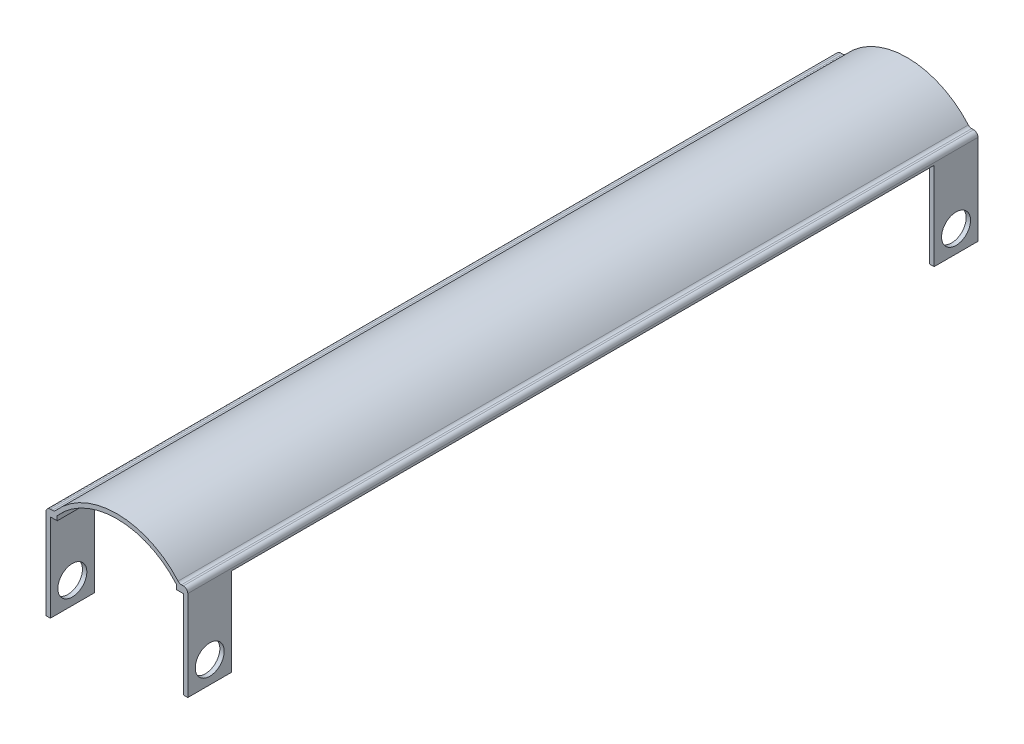
ISO-10303-21;
HEADER;
FILE_DESCRIPTION(('STEP AP214'),'2;1');
FILE_NAME('part.step','',(''),(''),'','','');
FILE_SCHEMA(('AUTOMOTIVE_DESIGN { 1 0 10303 214 1 1 1 1 }'));
ENDSEC;
DATA;
#1=APPLICATION_CONTEXT('core data for automotive mechanical design processes');
#2=APPLICATION_PROTOCOL_DEFINITION('international standard','automotive_design',2000,#1);
#3=PRODUCT_CONTEXT('',#1,'mechanical');
#4=PRODUCT('Part','Part','',(#3));
#5=PRODUCT_RELATED_PRODUCT_CATEGORY('part','',(#4));
#6=PRODUCT_DEFINITION_FORMATION('','',#4);
#7=PRODUCT_DEFINITION_CONTEXT('part definition',#1,'design');
#8=PRODUCT_DEFINITION('design','',#6,#7);
#9=PRODUCT_DEFINITION_SHAPE('','',#8);
#10=(LENGTH_UNIT() NAMED_UNIT(*) SI_UNIT(.MILLI.,.METRE.));
#11=(NAMED_UNIT(*) PLANE_ANGLE_UNIT() SI_UNIT($,.RADIAN.));
#12=(NAMED_UNIT(*) SI_UNIT($,.STERADIAN.) SOLID_ANGLE_UNIT());
#13=UNCERTAINTY_MEASURE_WITH_UNIT(LENGTH_MEASURE(1.E-05),#10,'distance_accuracy_value','');
#14=(GEOMETRIC_REPRESENTATION_CONTEXT(3) GLOBAL_UNCERTAINTY_ASSIGNED_CONTEXT((#13)) GLOBAL_UNIT_ASSIGNED_CONTEXT((#10,
#11,#12)) REPRESENTATION_CONTEXT('',''));
#15=CARTESIAN_POINT('',(0.,0.,0.));
#16=DIRECTION('',(0.,0.,1.));
#17=DIRECTION('',(1.,0.,0.));
#18=AXIS2_PLACEMENT_3D('',#15,#16,#17);
#19=CARTESIAN_POINT('',(-15.1499999999744,-21.5219779090157,180.));
#20=DIRECTION('',(0.,1.,0.));
#21=DIRECTION('',(0.,0.,1.));
#22=AXIS2_PLACEMENT_3D('',#19,#20,#21);
#23=PLANE('',#22);
#24=DIRECTION('',(0.,0.,-1.));
#25=VECTOR('',#24,1.);
#26=CARTESIAN_POINT('',(-15.1499999999744,-21.5219779090157,180.));
#27=LINE('',#26,#25);
#28=CARTESIAN_POINT('',(-15.1499999999744,-21.5219779090113,10.));
#29=VERTEX_POINT('',#28);
#30=CARTESIAN_POINT('',(-15.1499999999744,-21.5219779090157,0.));
#31=VERTEX_POINT('',#30);
#32=EDGE_CURVE('E383',#29,#31,#27,.T.);
#33=ORIENTED_EDGE('',*,*,#32,.F.);
#34=DIRECTION('',(1.,0.,0.));
#35=VECTOR('',#34,1.);
#36=CARTESIAN_POINT('',(-16.1499999999744,-21.5219779090113,10.));
#37=LINE('',#36,#35);
#38=CARTESIAN_POINT('',(-16.1499999999744,-21.5219779090113,10.));
#39=VERTEX_POINT('',#38);
#40=EDGE_CURVE('E255',#39,#29,#37,.T.);
#41=ORIENTED_EDGE('',*,*,#40,.F.);
#42=DIRECTION('',(0.,0.,-1.));
#43=VECTOR('',#42,1.);
#44=CARTESIAN_POINT('',(-16.1499999999744,-21.5219779090157,180.));
#45=LINE('',#44,#43);
#46=CARTESIAN_POINT('',(-16.1499999999744,-21.5219779090157,0.));
#47=VERTEX_POINT('',#46);
#48=EDGE_CURVE('E387',#39,#47,#45,.T.);
#49=ORIENTED_EDGE('',*,*,#48,.T.);
#50=DIRECTION('',(1.,0.,0.));
#51=VECTOR('',#50,1.);
#52=CARTESIAN_POINT('',(-15.1499999999744,-21.5219779090157,0.));
#53=LINE('',#52,#51);
#54=EDGE_CURVE('E331',#47,#31,#53,.T.);
#55=ORIENTED_EDGE('',*,*,#54,.T.);
#56=EDGE_LOOP('',(#33,#41,#49,#55));
#57=FACE_BOUND('',#56,.T.);
#58=ADVANCED_FACE('F39',(#57),#23,.F.);
#59=CARTESIAN_POINT('',(-15.1499999999744,-1.52197790901574,180.));
#60=DIRECTION('',(-1.,0.,0.));
#61=DIRECTION('',(0.,-1.,0.));
#62=AXIS2_PLACEMENT_3D('',#59,#60,#61);
#63=PLANE('',#62);
#64=CARTESIAN_POINT('',(-15.1499999999744,-16.521977909016,5.));
#65=DIRECTION('',(-1.,0.,0.));
#66=DIRECTION('',(0.,-1.,0.));
#67=AXIS2_PLACEMENT_3D('',#64,#65,#66);
#68=CIRCLE('',#67,3.29999999999999);
#69=CARTESIAN_POINT('',(-15.1499999999744,-19.8219779090159,5.));
#70=VERTEX_POINT('',#69);
#71=EDGE_CURVE('E288',#70,#70,#68,.T.);
#72=ORIENTED_EDGE('',*,*,#71,.T.);
#73=EDGE_LOOP('',(#72));
#74=FACE_BOUND('',#73,.T.);
#75=DIRECTION('',(0.,0.,-1.));
#76=VECTOR('',#75,1.);
#77=CARTESIAN_POINT('',(-15.1499999999744,-1.52197790901574,180.));
#78=LINE('',#77,#76);
#79=CARTESIAN_POINT('',(-15.1499999999744,-1.52197790901128,10.));
#80=VERTEX_POINT('',#79);
#81=CARTESIAN_POINT('',(-15.1499999999744,-1.52197790901574,0.));
#82=VERTEX_POINT('',#81);
#83=EDGE_CURVE('E381',#80,#82,#78,.T.);
#84=ORIENTED_EDGE('',*,*,#83,.F.);
#85=DIRECTION('',(0.,-1.,0.));
#86=VECTOR('',#85,1.);
#87=CARTESIAN_POINT('',(-15.1499999999744,-1.52197790901572,10.));
#88=LINE('',#87,#86);
#89=EDGE_CURVE('E266',#80,#29,#88,.T.);
#90=ORIENTED_EDGE('',*,*,#89,.T.);
#91=ORIENTED_EDGE('',*,*,#32,.T.);
#92=DIRECTION('',(0.,1.,0.));
#93=VECTOR('',#92,1.);
#94=CARTESIAN_POINT('',(-15.1499999999744,-1.52197790901574,0.));
#95=LINE('',#94,#93);
#96=EDGE_CURVE('E334',#31,#82,#95,.T.);
#97=ORIENTED_EDGE('',*,*,#96,.T.);
#98=EDGE_LOOP('',(#84,#90,#91,#97));
#99=FACE_BOUND('',#98,.T.);
#100=ADVANCED_FACE('F503',(#74,#99),#63,.F.);
#101=CARTESIAN_POINT('',(15.1499999999744,-1.52197790901128,180.));
#102=DIRECTION('',(1.,0.,0.));
#103=DIRECTION('',(0.,1.,0.));
#104=AXIS2_PLACEMENT_3D('',#101,#102,#103);
#105=PLANE('',#104);
#106=CARTESIAN_POINT('',(15.1499999999744,-16.521977909016,5.));
#107=DIRECTION('',(1.,0.,0.));
#108=DIRECTION('',(0.,1.,0.));
#109=AXIS2_PLACEMENT_3D('',#106,#107,#108);
#110=CIRCLE('',#109,3.29999999999999);
#111=CARTESIAN_POINT('',(15.1499999999744,-13.221977909016,5.));
#112=VERTEX_POINT('',#111);
#113=EDGE_CURVE('E287',#112,#112,#110,.T.);
#114=ORIENTED_EDGE('',*,*,#113,.T.);
#115=EDGE_LOOP('',(#114));
#116=FACE_BOUND('',#115,.T.);
#117=DIRECTION('',(0.,0.,-1.));
#118=VECTOR('',#117,1.);
#119=CARTESIAN_POINT('',(15.1499999999744,-21.5219779090113,180.));
#120=LINE('',#119,#118);
#121=CARTESIAN_POINT('',(15.1499999999744,-21.5219779090113,10.));
#122=VERTEX_POINT('',#121);
#123=CARTESIAN_POINT('',(15.1499999999744,-21.5219779090113,0.));
#124=VERTEX_POINT('',#123);
#125=EDGE_CURVE('E363',#122,#124,#120,.T.);
#126=ORIENTED_EDGE('',*,*,#125,.F.);
#127=DIRECTION('',(0.,1.,0.));
#128=VECTOR('',#127,1.);
#129=CARTESIAN_POINT('',(15.1499999999744,-1.52197790901126,10.));
#130=LINE('',#129,#128);
#131=CARTESIAN_POINT('',(15.1499999999744,-1.52197790901128,10.));
#132=VERTEX_POINT('',#131);
#133=EDGE_CURVE('E263',#122,#132,#130,.T.);
#134=ORIENTED_EDGE('',*,*,#133,.T.);
#135=DIRECTION('',(0.,0.,-1.));
#136=VECTOR('',#135,1.);
#137=CARTESIAN_POINT('',(15.1499999999744,-1.52197790901128,180.));
#138=LINE('',#137,#136);
#139=CARTESIAN_POINT('',(15.1499999999744,-1.52197790901128,0.));
#140=VERTEX_POINT('',#139);
#141=EDGE_CURVE('E367',#132,#140,#138,.T.);
#142=ORIENTED_EDGE('',*,*,#141,.T.);
#143=DIRECTION('',(0.,-1.,0.));
#144=VECTOR('',#143,1.);
#145=CARTESIAN_POINT('',(15.1499999999744,-1.52197790901128,0.));
#146=LINE('',#145,#144);
#147=EDGE_CURVE('E350',#140,#124,#146,.T.);
#148=ORIENTED_EDGE('',*,*,#147,.T.);
#149=EDGE_LOOP('',(#126,#134,#142,#148));
#150=FACE_BOUND('',#149,.T.);
#151=ADVANCED_FACE('F510',(#116,#150),#105,.F.);
#152=CARTESIAN_POINT('',(15.1499999999744,-21.5219779090113,180.));
#153=DIRECTION('',(0.,1.,0.));
#154=DIRECTION('',(0.,0.,1.));
#155=AXIS2_PLACEMENT_3D('',#152,#153,#154);
#156=PLANE('',#155);
#157=DIRECTION('',(0.,0.,-1.));
#158=VECTOR('',#157,1.);
#159=CARTESIAN_POINT('',(16.1499999999744,-21.5219779090113,180.));
#160=LINE('',#159,#158);
#161=CARTESIAN_POINT('',(16.1499999999744,-21.5219779090113,10.));
#162=VERTEX_POINT('',#161);
#163=CARTESIAN_POINT('',(16.1499999999744,-21.5219779090113,0.));
#164=VERTEX_POINT('',#163);
#165=EDGE_CURVE('E323',#162,#164,#160,.T.);
#166=ORIENTED_EDGE('',*,*,#165,.F.);
#167=EDGE_CURVE('E257',#122,#162,#37,.T.);
#168=ORIENTED_EDGE('',*,*,#167,.F.);
#169=ORIENTED_EDGE('',*,*,#125,.T.);
#170=DIRECTION('',(1.,0.,0.));
#171=VECTOR('',#170,1.);
#172=CARTESIAN_POINT('',(15.1499999999744,-21.5219779090113,0.));
#173=LINE('',#172,#171);
#174=EDGE_CURVE('E353',#124,#164,#173,.T.);
#175=ORIENTED_EDGE('',*,*,#174,.T.);
#176=EDGE_LOOP('',(#166,#168,#169,#175));
#177=FACE_BOUND('',#176,.T.);
#178=ADVANCED_FACE('F533',(#177),#156,.F.);
#179=CARTESIAN_POINT('',(0.,-11.8207049987248,180.));
#180=DIRECTION('',(0.,0.,-1.));
#181=DIRECTION('',(-1.,0.,0.));
#182=AXIS2_PLACEMENT_3D('',#179,#180,#181);
#183=CYLINDRICAL_SURFACE('',#182,18.5);
#184=CARTESIAN_POINT('',(0.,-11.8207049987248,180.));
#185=DIRECTION('',(0.,0.,1.));
#186=DIRECTION('',(-1.,0.,0.));
#187=AXIS2_PLACEMENT_3D('',#184,#185,#186);
#188=CIRCLE('',#187,18.5);
#189=CARTESIAN_POINT('',(13.9393602530622,0.342527948783339,180.));
#190=VERTEX_POINT('',#189);
#191=CARTESIAN_POINT('',(-13.9393602530622,0.342527948783339,180.));
#192=VERTEX_POINT('',#191);
#193=EDGE_CURVE('E292',#190,#192,#188,.T.);
#194=ORIENTED_EDGE('',*,*,#193,.F.);
#195=DIRECTION('',(0.,0.,-1.));
#196=VECTOR('',#195,1.);
#197=CARTESIAN_POINT('',(13.9393602530622,0.342527948783339,180.));
#198=LINE('',#197,#196);
#199=CARTESIAN_POINT('',(13.9393602530622,0.342527948783339,0.));
#200=VERTEX_POINT('',#199);
#201=EDGE_CURVE('E415',#190,#200,#198,.T.);
#202=ORIENTED_EDGE('',*,*,#201,.T.);
#203=CARTESIAN_POINT('',(0.,-11.8207049987248,0.));
#204=DIRECTION('',(0.,0.,1.));
#205=DIRECTION('',(-1.,0.,0.));
#206=AXIS2_PLACEMENT_3D('',#203,#204,#205);
#207=CIRCLE('',#206,18.5);
#208=CARTESIAN_POINT('',(-13.9393602530622,0.342527948783339,0.));
#209=VERTEX_POINT('',#208);
#210=EDGE_CURVE('E291',#200,#209,#207,.T.);
#211=ORIENTED_EDGE('',*,*,#210,.T.);
#212=DIRECTION('',(0.,0.,-1.));
#213=VECTOR('',#212,1.);
#214=CARTESIAN_POINT('',(-13.9393602530622,0.342527948783337,180.));
#215=LINE('',#214,#213);
#216=EDGE_CURVE('E413',#209,#192,#215,.F.);
#217=ORIENTED_EDGE('',*,*,#216,.T.);
#218=EDGE_LOOP('',(#194,#202,#211,#217));
#219=FACE_BOUND('',#218,.T.);
#220=ADVANCED_FACE('F431',(#219),#183,.T.);
#221=CARTESIAN_POINT('',(-16.1499999999744,0.,180.));
#222=DIRECTION('',(0.,-1.,0.));
#223=DIRECTION('',(0.,0.,-1.));
#224=AXIS2_PLACEMENT_3D('',#221,#222,#223);
#225=PLANE('',#224);
#226=DIRECTION('',(-1.,0.,0.));
#227=VECTOR('',#226,1.);
#228=CARTESIAN_POINT('',(-16.1499999999744,0.,0.));
#229=LINE('',#228,#227);
#230=CARTESIAN_POINT('',(-14.6928391856602,0.,0.));
#231=VERTEX_POINT('',#230);
#232=CARTESIAN_POINT('',(-15.1499999999744,0.,0.));
#233=VERTEX_POINT('',#232);
#234=EDGE_CURVE('E326',#231,#233,#229,.T.);
#235=ORIENTED_EDGE('',*,*,#234,.T.);
#236=DIRECTION('',(0.,0.,-1.));
#237=VECTOR('',#236,1.);
#238=CARTESIAN_POINT('',(-15.1499999999744,0.,180.));
#239=LINE('',#238,#237);
#240=CARTESIAN_POINT('',(-15.1499999999744,0.,180.));
#241=VERTEX_POINT('',#240);
#242=EDGE_CURVE('E402',#233,#241,#239,.F.);
#243=ORIENTED_EDGE('',*,*,#242,.T.);
#244=DIRECTION('',(-1.,0.,0.));
#245=VECTOR('',#244,1.);
#246=CARTESIAN_POINT('',(-16.1499999999744,0.,180.));
#247=LINE('',#246,#245);
#248=CARTESIAN_POINT('',(-14.6928391856602,0.,180.));
#249=VERTEX_POINT('',#248);
#250=EDGE_CURVE('E295',#249,#241,#247,.T.);
#251=ORIENTED_EDGE('',*,*,#250,.F.);
#252=DIRECTION('',(0.,0.,1.));
#253=VECTOR('',#252,1.);
#254=CARTESIAN_POINT('',(-14.6928391856602,0.,0.));
#255=LINE('',#254,#253);
#256=EDGE_CURVE('E399',#249,#231,#255,.F.);
#257=ORIENTED_EDGE('',*,*,#256,.T.);
#258=EDGE_LOOP('',(#235,#243,#251,#257));
#259=FACE_BOUND('',#258,.T.);
#260=ADVANCED_FACE('F438',(#259),#225,.F.);
#261=CARTESIAN_POINT('',(-16.1499999999744,-21.5219779090157,180.));
#262=DIRECTION('',(1.,0.,0.));
#263=DIRECTION('',(0.,1.,0.));
#264=AXIS2_PLACEMENT_3D('',#261,#262,#263);
#265=PLANE('',#264);
#266=CARTESIAN_POINT('',(-16.1499999999707,-16.521977909016,175.));
#267=DIRECTION('',(-1.,0.,0.));
#268=DIRECTION('',(0.,0.,1.));
#269=AXIS2_PLACEMENT_3D('',#266,#267,#268);
#270=CIRCLE('',#269,3.3);
#271=CARTESIAN_POINT('',(-16.1499999999707,-16.521977909016,178.3));
#272=VERTEX_POINT('',#271);
#273=EDGE_CURVE('E269',#272,#272,#270,.T.);
#274=ORIENTED_EDGE('',*,*,#273,.F.);
#275=EDGE_LOOP('',(#274));
#276=FACE_BOUND('',#275,.T.);
#277=CARTESIAN_POINT('',(-16.1499999999707,-16.521977909016,5.));
#278=DIRECTION('',(-1.,0.,0.));
#279=DIRECTION('',(0.,0.,1.));
#280=AXIS2_PLACEMENT_3D('',#277,#278,#279);
#281=CIRCLE('',#280,3.3);
#282=CARTESIAN_POINT('',(-16.1499999999707,-16.521977909016,8.3));
#283=VERTEX_POINT('',#282);
#284=EDGE_CURVE('E281',#283,#283,#281,.T.);
#285=ORIENTED_EDGE('',*,*,#284,.F.);
#286=EDGE_LOOP('',(#285));
#287=FACE_BOUND('',#286,.T.);
#288=DIRECTION('',(0.,-1.,0.));
#289=VECTOR('',#288,1.);
#290=CARTESIAN_POINT('',(-16.1499999999744,-21.5219779090157,180.));
#291=LINE('',#290,#289);
#292=CARTESIAN_POINT('',(-16.1499999999744,-1.,180.));
#293=VERTEX_POINT('',#292);
#294=CARTESIAN_POINT('',(-16.1499999999744,-21.5219779090157,180.));
#295=VERTEX_POINT('',#294);
#296=EDGE_CURVE('E299',#293,#295,#291,.T.);
#297=ORIENTED_EDGE('',*,*,#296,.F.);
#298=DIRECTION('',(0.,0.,-1.));
#299=VECTOR('',#298,1.);
#300=CARTESIAN_POINT('',(-16.1499999999744,-1.,180.));
#301=LINE('',#300,#299);
#302=CARTESIAN_POINT('',(-16.1499999999744,-1.,0.));
#303=VERTEX_POINT('',#302);
#304=EDGE_CURVE('E390',#293,#303,#301,.T.);
#305=ORIENTED_EDGE('',*,*,#304,.T.);
#306=DIRECTION('',(0.,-1.,0.));
#307=VECTOR('',#306,1.);
#308=CARTESIAN_POINT('',(-16.1499999999744,-21.5219779090157,0.));
#309=LINE('',#308,#307);
#310=EDGE_CURVE('E329',#303,#47,#309,.T.);
#311=ORIENTED_EDGE('',*,*,#310,.T.);
#312=ORIENTED_EDGE('',*,*,#48,.F.);
#313=DIRECTION('',(0.,1.,0.));
#314=VECTOR('',#313,1.);
#315=CARTESIAN_POINT('',(-16.1499999999744,-21.5219779090113,10.));
#316=LINE('',#315,#314);
#317=CARTESIAN_POINT('',(-16.1499999999744,-1.52197790901128,10.));
#318=VERTEX_POINT('',#317);
#319=EDGE_CURVE('E236',#39,#318,#316,.T.);
#320=ORIENTED_EDGE('',*,*,#319,.T.);
#321=DIRECTION('',(0.,0.,1.));
#322=VECTOR('',#321,1.);
#323=CARTESIAN_POINT('',(-16.1499999999744,-1.52197790901128,170.));
#324=LINE('',#323,#322);
#325=CARTESIAN_POINT('',(-16.1499999999744,-1.52197790901128,170.));
#326=VERTEX_POINT('',#325);
#327=EDGE_CURVE('E218',#318,#326,#324,.T.);
#328=ORIENTED_EDGE('',*,*,#327,.T.);
#329=DIRECTION('',(0.,-1.,0.));
#330=VECTOR('',#329,1.);
#331=CARTESIAN_POINT('',(-16.1499999999744,-21.5219779090113,170.));
#332=LINE('',#331,#330);
#333=CARTESIAN_POINT('',(-16.1499999999744,-21.5219779090113,170.));
#334=VERTEX_POINT('',#333);
#335=EDGE_CURVE('E229',#326,#334,#332,.T.);
#336=ORIENTED_EDGE('',*,*,#335,.T.);
#337=EDGE_CURVE('E388',#295,#334,#45,.T.);
#338=ORIENTED_EDGE('',*,*,#337,.F.);
#339=EDGE_LOOP('',(#297,#305,#311,#312,#320,#328,#336,#338));
#340=FACE_BOUND('',#339,.T.);
#341=ADVANCED_FACE('F239',(#276,#287,#340),#265,.F.);
#342=ORIENTED_EDGE('',*,*,#337,.T.);
#343=DIRECTION('',(1.,0.,0.));
#344=VECTOR('',#343,1.);
#345=CARTESIAN_POINT('',(-16.1499999999744,-21.5219779090113,170.));
#346=LINE('',#345,#344);
#347=CARTESIAN_POINT('',(-15.1499999999744,-21.5219779090113,170.));
#348=VERTEX_POINT('',#347);
#349=EDGE_CURVE('E232',#334,#348,#346,.T.);
#350=ORIENTED_EDGE('',*,*,#349,.T.);
#351=CARTESIAN_POINT('',(-15.1499999999744,-21.5219779090157,180.));
#352=VERTEX_POINT('',#351);
#353=EDGE_CURVE('E384',#352,#348,#27,.T.);
#354=ORIENTED_EDGE('',*,*,#353,.F.);
#355=DIRECTION('',(1.,0.,0.));
#356=VECTOR('',#355,1.);
#357=CARTESIAN_POINT('',(-15.1499999999744,-21.5219779090157,180.));
#358=LINE('',#357,#356);
#359=EDGE_CURVE('E301',#295,#352,#358,.T.);
#360=ORIENTED_EDGE('',*,*,#359,.F.);
#361=EDGE_LOOP('',(#342,#350,#354,#360));
#362=FACE_BOUND('',#361,.T.);
#363=ADVANCED_FACE('F446',(#362),#23,.F.);
#364=CARTESIAN_POINT('',(-15.1499999999744,-16.521977909016,175.));
#365=DIRECTION('',(-1.,0.,0.));
#366=DIRECTION('',(0.,-1.,0.));
#367=AXIS2_PLACEMENT_3D('',#364,#365,#366);
#368=CIRCLE('',#367,3.29999999999999);
#369=CARTESIAN_POINT('',(-15.1499999999744,-19.8219779090159,175.));
#370=VERTEX_POINT('',#369);
#371=EDGE_CURVE('E275',#370,#370,#368,.T.);
#372=ORIENTED_EDGE('',*,*,#371,.T.);
#373=EDGE_LOOP('',(#372));
#374=FACE_BOUND('',#373,.T.);
#375=ORIENTED_EDGE('',*,*,#353,.T.);
#376=DIRECTION('',(0.,1.,0.));
#377=VECTOR('',#376,1.);
#378=CARTESIAN_POINT('',(-15.1499999999744,-1.52197790901574,170.));
#379=LINE('',#378,#377);
#380=CARTESIAN_POINT('',(-15.1499999999744,-1.52197790901574,170.));
#381=VERTEX_POINT('',#380);
#382=EDGE_CURVE('E261',#348,#381,#379,.T.);
#383=ORIENTED_EDGE('',*,*,#382,.T.);
#384=CARTESIAN_POINT('',(-15.1499999999744,-1.52197790901574,180.));
#385=VERTEX_POINT('',#384);
#386=EDGE_CURVE('E222',#385,#381,#78,.T.);
#387=ORIENTED_EDGE('',*,*,#386,.F.);
#388=DIRECTION('',(0.,1.,0.));
#389=VECTOR('',#388,1.);
#390=CARTESIAN_POINT('',(-15.1499999999744,-1.52197790901574,180.));
#391=LINE('',#390,#389);
#392=EDGE_CURVE('E303',#352,#385,#391,.T.);
#393=ORIENTED_EDGE('',*,*,#392,.F.);
#394=EDGE_LOOP('',(#375,#383,#387,#393));
#395=FACE_BOUND('',#394,.T.);
#396=ADVANCED_FACE('F450',(#374,#395),#63,.F.);
#397=CARTESIAN_POINT('',(-13.5937499999985,-1.52197790901128,180.));
#398=DIRECTION('',(0.,1.,0.));
#399=DIRECTION('',(0.,0.,1.));
#400=AXIS2_PLACEMENT_3D('',#397,#398,#399);
#401=PLANE('',#400);
#402=ORIENTED_EDGE('',*,*,#386,.T.);
#403=DIRECTION('',(1.,0.,0.));
#404=VECTOR('',#403,1.);
#405=CARTESIAN_POINT('',(-16.1499999999744,-1.52197790901128,170.));
#406=LINE('',#405,#404);
#407=EDGE_CURVE('E213',#326,#381,#406,.T.);
#408=ORIENTED_EDGE('',*,*,#407,.F.);
#409=ORIENTED_EDGE('',*,*,#327,.F.);
#410=DIRECTION('',(1.,0.,0.));
#411=VECTOR('',#410,1.);
#412=CARTESIAN_POINT('',(-16.1499999999744,-1.52197790901128,10.));
#413=LINE('',#412,#411);
#414=EDGE_CURVE('E251',#318,#80,#413,.T.);
#415=ORIENTED_EDGE('',*,*,#414,.T.);
#416=ORIENTED_EDGE('',*,*,#83,.T.);
#417=DIRECTION('',(1.,0.,0.));
#418=VECTOR('',#417,1.);
#419=CARTESIAN_POINT('',(-13.5937499999985,-1.52197790901128,0.));
#420=LINE('',#419,#418);
#421=CARTESIAN_POINT('',(-13.5937499999985,-1.52197790901128,0.));
#422=VERTEX_POINT('',#421);
#423=EDGE_CURVE('E337',#82,#422,#420,.T.);
#424=ORIENTED_EDGE('',*,*,#423,.T.);
#425=DIRECTION('',(0.,0.,-1.));
#426=VECTOR('',#425,1.);
#427=CARTESIAN_POINT('',(-13.5937499999985,-1.52197790901128,180.));
#428=LINE('',#427,#426);
#429=CARTESIAN_POINT('',(-13.5937499999985,-1.52197790901128,180.));
#430=VERTEX_POINT('',#429);
#431=EDGE_CURVE('E379',#430,#422,#428,.T.);
#432=ORIENTED_EDGE('',*,*,#431,.F.);
#433=DIRECTION('',(1.,2.97114763371676E-11,0.));
#434=VECTOR('',#433,1.);
#435=CARTESIAN_POINT('',(-14.9999999999864,-1.52197790901128,180.));
#436=LINE('',#435,#434);
#437=EDGE_CURVE('E305',#385,#430,#436,.T.);
#438=ORIENTED_EDGE('',*,*,#437,.F.);
#439=EDGE_LOOP('',(#402,#408,#409,#415,#416,#424,#432,#438));
#440=FACE_BOUND('',#439,.T.);
#441=ADVANCED_FACE('F215',(#440),#401,.F.);
#442=CARTESIAN_POINT('',(-13.5937499999985,-0.521977909011278,180.));
#443=DIRECTION('',(-1.,0.,0.));
#444=DIRECTION('',(0.,0.,1.));
#445=AXIS2_PLACEMENT_3D('',#442,#443,#444);
#446=PLANE('',#445);
#447=DIRECTION('',(0.,1.,0.));
#448=VECTOR('',#447,1.);
#449=CARTESIAN_POINT('',(-13.5937499999985,-0.521977909011278,0.));
#450=LINE('',#449,#448);
#451=CARTESIAN_POINT('',(-13.5937499999985,-0.521977909011279,0.));
#452=VERTEX_POINT('',#451);
#453=EDGE_CURVE('E340',#422,#452,#450,.T.);
#454=ORIENTED_EDGE('',*,*,#453,.T.);
#455=DIRECTION('',(0.,0.,-1.));
#456=VECTOR('',#455,1.);
#457=CARTESIAN_POINT('',(-13.5937499999985,-0.521977909011279,180.));
#458=LINE('',#457,#456);
#459=CARTESIAN_POINT('',(-13.5937499999985,-0.521977909011279,180.));
#460=VERTEX_POINT('',#459);
#461=EDGE_CURVE('E376',#460,#452,#458,.T.);
#462=ORIENTED_EDGE('',*,*,#461,.F.);
#463=DIRECTION('',(0.,1.,0.));
#464=VECTOR('',#463,1.);
#465=CARTESIAN_POINT('',(-13.5937499999985,-0.521977909011278,180.));
#466=LINE('',#465,#464);
#467=EDGE_CURVE('E307',#430,#460,#466,.T.);
#468=ORIENTED_EDGE('',*,*,#467,.F.);
#469=ORIENTED_EDGE('',*,*,#431,.T.);
#470=EDGE_LOOP('',(#454,#462,#468,#469));
#471=FACE_BOUND('',#470,.T.);
#472=ADVANCED_FACE('F456',(#471),#446,.F.);
#473=CARTESIAN_POINT('',(0.,-12.3207049987248,180.));
#474=DIRECTION('',(0.,0.,-1.));
#475=DIRECTION('',(-1.,0.,0.));
#476=AXIS2_PLACEMENT_3D('',#473,#474,#475);
#477=CYLINDRICAL_SURFACE('',#476,18.);
#478=CARTESIAN_POINT('',(0.,-12.3207049987248,0.));
#479=DIRECTION('',(0.,0.,-1.));
#480=DIRECTION('',(-1.,0.,0.));
#481=AXIS2_PLACEMENT_3D('',#478,#479,#480);
#482=CIRCLE('',#481,18.);
#483=CARTESIAN_POINT('',(13.5937499999985,-0.521977909011282,0.));
#484=VERTEX_POINT('',#483);
#485=EDGE_CURVE('E342',#452,#484,#482,.T.);
#486=ORIENTED_EDGE('',*,*,#485,.T.);
#487=DIRECTION('',(0.,0.,-1.));
#488=VECTOR('',#487,1.);
#489=CARTESIAN_POINT('',(13.5937499999985,-0.521977909011282,180.));
#490=LINE('',#489,#488);
#491=CARTESIAN_POINT('',(13.5937499999985,-0.521977909011282,180.));
#492=VERTEX_POINT('',#491);
#493=EDGE_CURVE('E373',#492,#484,#490,.T.);
#494=ORIENTED_EDGE('',*,*,#493,.F.);
#495=CARTESIAN_POINT('',(0.,-12.3207049987248,180.));
#496=DIRECTION('',(0.,0.,-1.));
#497=DIRECTION('',(-1.,0.,0.));
#498=AXIS2_PLACEMENT_3D('',#495,#496,#497);
#499=CIRCLE('',#498,18.);
#500=EDGE_CURVE('E309',#460,#492,#499,.T.);
#501=ORIENTED_EDGE('',*,*,#500,.F.);
#502=ORIENTED_EDGE('',*,*,#461,.T.);
#503=EDGE_LOOP('',(#486,#494,#501,#502));
#504=FACE_BOUND('',#503,.T.);
#505=ADVANCED_FACE('F462',(#504),#477,.F.);
#506=CARTESIAN_POINT('',(13.5937499999985,-0.521977909011282,180.));
#507=DIRECTION('',(1.,0.,0.));
#508=DIRECTION('',(0.,0.,-1.));
#509=AXIS2_PLACEMENT_3D('',#506,#507,#508);
#510=PLANE('',#509);
#511=DIRECTION('',(0.,-1.,0.));
#512=VECTOR('',#511,1.);
#513=CARTESIAN_POINT('',(13.5937499999985,-0.521977909011282,0.));
#514=LINE('',#513,#512);
#515=CARTESIAN_POINT('',(13.5937499999985,-1.52197790901128,0.));
#516=VERTEX_POINT('',#515);
#517=EDGE_CURVE('E344',#484,#516,#514,.T.);
#518=ORIENTED_EDGE('',*,*,#517,.T.);
#519=DIRECTION('',(0.,0.,-1.));
#520=VECTOR('',#519,1.);
#521=CARTESIAN_POINT('',(13.5937499999985,-1.52197790901128,180.));
#522=LINE('',#521,#520);
#523=CARTESIAN_POINT('',(13.5937499999985,-1.52197790901128,180.));
#524=VERTEX_POINT('',#523);
#525=EDGE_CURVE('E371',#524,#516,#522,.T.);
#526=ORIENTED_EDGE('',*,*,#525,.F.);
#527=DIRECTION('',(0.,-1.,0.));
#528=VECTOR('',#527,1.);
#529=CARTESIAN_POINT('',(13.5937499999985,-0.521977909011282,180.));
#530=LINE('',#529,#528);
#531=EDGE_CURVE('E311',#492,#524,#530,.T.);
#532=ORIENTED_EDGE('',*,*,#531,.F.);
#533=ORIENTED_EDGE('',*,*,#493,.T.);
#534=EDGE_LOOP('',(#518,#526,#532,#533));
#535=FACE_BOUND('',#534,.T.);
#536=ADVANCED_FACE('F466',(#535),#510,.F.);
#537=CARTESIAN_POINT('',(14.9999999999864,-1.52197790901128,180.));
#538=DIRECTION('',(0.,1.,0.));
#539=DIRECTION('',(0.,0.,1.));
#540=AXIS2_PLACEMENT_3D('',#537,#538,#539);
#541=PLANE('',#540);
#542=ORIENTED_EDGE('',*,*,#525,.T.);
#543=DIRECTION('',(1.,0.,0.));
#544=VECTOR('',#543,1.);
#545=CARTESIAN_POINT('',(14.9999999999864,-1.52197790901128,0.));
#546=LINE('',#545,#544);
#547=EDGE_CURVE('E347',#516,#140,#546,.T.);
#548=ORIENTED_EDGE('',*,*,#547,.T.);
#549=ORIENTED_EDGE('',*,*,#141,.F.);
#550=CARTESIAN_POINT('',(16.1499999999744,-1.52197790901128,10.));
#551=VERTEX_POINT('',#550);
#552=EDGE_CURVE('E254',#132,#551,#413,.T.);
#553=ORIENTED_EDGE('',*,*,#552,.T.);
#554=DIRECTION('',(0.,0.,1.));
#555=VECTOR('',#554,1.);
#556=CARTESIAN_POINT('',(16.1499999999744,-1.52197790901128,170.));
#557=LINE('',#556,#555);
#558=CARTESIAN_POINT('',(16.1499999999744,-1.52197790901128,170.));
#559=VERTEX_POINT('',#558);
#560=EDGE_CURVE('E248',#551,#559,#557,.T.);
#561=ORIENTED_EDGE('',*,*,#560,.T.);
#562=CARTESIAN_POINT('',(15.1499999999744,-1.52197790901128,170.));
#563=VERTEX_POINT('',#562);
#564=EDGE_CURVE('E226',#563,#559,#406,.T.);
#565=ORIENTED_EDGE('',*,*,#564,.F.);
#566=CARTESIAN_POINT('',(15.1499999999744,-1.52197790901128,180.));
#567=VERTEX_POINT('',#566);
#568=EDGE_CURVE('E368',#567,#563,#138,.T.);
#569=ORIENTED_EDGE('',*,*,#568,.F.);
#570=DIRECTION('',(1.,0.,0.));
#571=VECTOR('',#570,1.);
#572=CARTESIAN_POINT('',(13.5937499999985,-1.52197790901128,180.));
#573=LINE('',#572,#571);
#574=EDGE_CURVE('E313',#524,#567,#573,.T.);
#575=ORIENTED_EDGE('',*,*,#574,.F.);
#576=EDGE_LOOP('',(#542,#548,#549,#553,#561,#565,#569,#575));
#577=FACE_BOUND('',#576,.T.);
#578=ADVANCED_FACE('F471',(#577),#541,.F.);
#579=CARTESIAN_POINT('',(15.1499999999744,-16.521977909016,175.));
#580=DIRECTION('',(1.,0.,0.));
#581=DIRECTION('',(0.,1.,0.));
#582=AXIS2_PLACEMENT_3D('',#579,#580,#581);
#583=CIRCLE('',#582,3.29999999999999);
#584=CARTESIAN_POINT('',(15.1499999999744,-13.221977909016,175.));
#585=VERTEX_POINT('',#584);
#586=EDGE_CURVE('E278',#585,#585,#583,.T.);
#587=ORIENTED_EDGE('',*,*,#586,.T.);
#588=EDGE_LOOP('',(#587));
#589=FACE_BOUND('',#588,.T.);
#590=ORIENTED_EDGE('',*,*,#568,.T.);
#591=DIRECTION('',(0.,-1.,0.));
#592=VECTOR('',#591,1.);
#593=CARTESIAN_POINT('',(15.1499999999744,-1.52197790901128,170.));
#594=LINE('',#593,#592);
#595=CARTESIAN_POINT('',(15.1499999999744,-21.5219779090113,170.));
#596=VERTEX_POINT('',#595);
#597=EDGE_CURVE('E253',#563,#596,#594,.T.);
#598=ORIENTED_EDGE('',*,*,#597,.T.);
#599=CARTESIAN_POINT('',(15.1499999999744,-21.5219779090113,180.));
#600=VERTEX_POINT('',#599);
#601=EDGE_CURVE('E364',#600,#596,#120,.T.);
#602=ORIENTED_EDGE('',*,*,#601,.F.);
#603=DIRECTION('',(0.,-1.,0.));
#604=VECTOR('',#603,1.);
#605=CARTESIAN_POINT('',(15.1499999999744,-1.52197790901128,180.));
#606=LINE('',#605,#604);
#607=EDGE_CURVE('E315',#567,#600,#606,.T.);
#608=ORIENTED_EDGE('',*,*,#607,.F.);
#609=EDGE_LOOP('',(#590,#598,#602,#608));
#610=FACE_BOUND('',#609,.T.);
#611=ADVANCED_FACE('F478',(#589,#610),#105,.F.);
#612=ORIENTED_EDGE('',*,*,#601,.T.);
#613=CARTESIAN_POINT('',(16.1499999999744,-21.5219779090113,170.));
#614=VERTEX_POINT('',#613);
#615=EDGE_CURVE('E225',#596,#614,#346,.T.);
#616=ORIENTED_EDGE('',*,*,#615,.T.);
#617=CARTESIAN_POINT('',(16.1499999999744,-21.5219779090113,180.));
#618=VERTEX_POINT('',#617);
#619=EDGE_CURVE('E360',#618,#614,#160,.T.);
#620=ORIENTED_EDGE('',*,*,#619,.F.);
#621=DIRECTION('',(1.,0.,0.));
#622=VECTOR('',#621,1.);
#623=CARTESIAN_POINT('',(15.1499999999744,-21.5219779090113,180.));
#624=LINE('',#623,#622);
#625=EDGE_CURVE('E317',#600,#618,#624,.T.);
#626=ORIENTED_EDGE('',*,*,#625,.F.);
#627=EDGE_LOOP('',(#612,#616,#620,#626));
#628=FACE_BOUND('',#627,.T.);
#629=ADVANCED_FACE('F481',(#628),#156,.F.);
#630=CARTESIAN_POINT('',(16.1499999999744,-21.5219779090113,180.));
#631=DIRECTION('',(-1.,0.,0.));
#632=DIRECTION('',(0.,0.,1.));
#633=AXIS2_PLACEMENT_3D('',#630,#631,#632);
#634=PLANE('',#633);
#635=CARTESIAN_POINT('',(16.1499999999847,-16.521977909016,175.));
#636=DIRECTION('',(-1.,0.,0.));
#637=DIRECTION('',(0.,0.,1.));
#638=AXIS2_PLACEMENT_3D('',#635,#636,#637);
#639=CIRCLE('',#638,3.29999999999999);
#640=CARTESIAN_POINT('',(16.1499999999847,-16.521977909016,178.3));
#641=VERTEX_POINT('',#640);
#642=EDGE_CURVE('E272',#641,#641,#639,.T.);
#643=ORIENTED_EDGE('',*,*,#642,.T.);
#644=EDGE_LOOP('',(#643));
#645=FACE_BOUND('',#644,.T.);
#646=CARTESIAN_POINT('',(16.1499999999795,-16.521977909016,5.));
#647=DIRECTION('',(-1.,0.,0.));
#648=DIRECTION('',(0.,0.,1.));
#649=AXIS2_PLACEMENT_3D('',#646,#647,#648);
#650=CIRCLE('',#649,3.29999999999999);
#651=CARTESIAN_POINT('',(16.1499999999795,-16.521977909016,8.3));
#652=VERTEX_POINT('',#651);
#653=EDGE_CURVE('E284',#652,#652,#650,.T.);
#654=ORIENTED_EDGE('',*,*,#653,.T.);
#655=EDGE_LOOP('',(#654));
#656=FACE_BOUND('',#655,.T.);
#657=DIRECTION('',(0.,1.,0.));
#658=VECTOR('',#657,1.);
#659=CARTESIAN_POINT('',(16.1499999999744,-21.5219779090113,0.));
#660=LINE('',#659,#658);
#661=CARTESIAN_POINT('',(16.1499999999744,-1.,0.));
#662=VERTEX_POINT('',#661);
#663=EDGE_CURVE('E356',#164,#662,#660,.T.);
#664=ORIENTED_EDGE('',*,*,#663,.T.);
#665=DIRECTION('',(0.,0.,-1.));
#666=VECTOR('',#665,1.);
#667=CARTESIAN_POINT('',(16.1499999999744,-1.,180.));
#668=LINE('',#667,#666);
#669=CARTESIAN_POINT('',(16.1499999999744,-1.,180.));
#670=VERTEX_POINT('',#669);
#671=EDGE_CURVE('E411',#662,#670,#668,.F.);
#672=ORIENTED_EDGE('',*,*,#671,.T.);
#673=DIRECTION('',(0.,1.,0.));
#674=VECTOR('',#673,1.);
#675=CARTESIAN_POINT('',(16.1499999999744,-21.5219779090113,180.));
#676=LINE('',#675,#674);
#677=EDGE_CURVE('E319',#618,#670,#676,.T.);
#678=ORIENTED_EDGE('',*,*,#677,.F.);
#679=ORIENTED_EDGE('',*,*,#619,.T.);
#680=DIRECTION('',(0.,-1.,0.));
#681=VECTOR('',#680,1.);
#682=CARTESIAN_POINT('',(16.1499999999744,-21.5219779090113,170.));
#683=LINE('',#682,#681);
#684=EDGE_CURVE('E244',#559,#614,#683,.T.);
#685=ORIENTED_EDGE('',*,*,#684,.F.);
#686=ORIENTED_EDGE('',*,*,#560,.F.);
#687=DIRECTION('',(0.,1.,0.));
#688=VECTOR('',#687,1.);
#689=CARTESIAN_POINT('',(16.1499999999744,-21.5219779090113,10.));
#690=LINE('',#689,#688);
#691=EDGE_CURVE('E241',#162,#551,#690,.T.);
#692=ORIENTED_EDGE('',*,*,#691,.F.);
#693=ORIENTED_EDGE('',*,*,#165,.T.);
#694=EDGE_LOOP('',(#664,#672,#678,#679,#685,#686,#692,#693));
#695=FACE_BOUND('',#694,.T.);
#696=ADVANCED_FACE('F485',(#645,#656,#695),#634,.F.);
#697=CARTESIAN_POINT('',(16.1499999999744,0.,180.));
#698=DIRECTION('',(0.,-1.,0.));
#699=DIRECTION('',(1.,0.,0.));
#700=AXIS2_PLACEMENT_3D('',#697,#698,#699);
#701=PLANE('',#700);
#702=DIRECTION('',(-1.,0.,0.));
#703=VECTOR('',#702,1.);
#704=CARTESIAN_POINT('',(16.1499999999744,0.,180.));
#705=LINE('',#704,#703);
#706=CARTESIAN_POINT('',(15.1499999999744,0.,180.));
#707=VERTEX_POINT('',#706);
#708=CARTESIAN_POINT('',(14.6928391856602,0.,180.));
#709=VERTEX_POINT('',#708);
#710=EDGE_CURVE('E321',#707,#709,#705,.T.);
#711=ORIENTED_EDGE('',*,*,#710,.F.);
#712=DIRECTION('',(0.,0.,-1.));
#713=VECTOR('',#712,1.);
#714=CARTESIAN_POINT('',(15.1499999999744,0.,180.));
#715=LINE('',#714,#713);
#716=CARTESIAN_POINT('',(15.1499999999744,0.,0.));
#717=VERTEX_POINT('',#716);
#718=EDGE_CURVE('E408',#707,#717,#715,.T.);
#719=ORIENTED_EDGE('',*,*,#718,.T.);
#720=DIRECTION('',(-1.,0.,0.));
#721=VECTOR('',#720,1.);
#722=CARTESIAN_POINT('',(16.1499999999744,0.,0.));
#723=LINE('',#722,#721);
#724=CARTESIAN_POINT('',(14.6928391856602,0.,0.));
#725=VERTEX_POINT('',#724);
#726=EDGE_CURVE('E296',#717,#725,#723,.T.);
#727=ORIENTED_EDGE('',*,*,#726,.T.);
#728=DIRECTION('',(0.,0.,1.));
#729=VECTOR('',#728,1.);
#730=CARTESIAN_POINT('',(14.6928391856602,0.,180.));
#731=LINE('',#730,#729);
#732=EDGE_CURVE('E54',#725,#709,#731,.T.);
#733=ORIENTED_EDGE('',*,*,#732,.T.);
#734=EDGE_LOOP('',(#711,#719,#727,#733));
#735=FACE_BOUND('',#734,.T.);
#736=ADVANCED_FACE('F491',(#735),#701,.F.);
#737=CARTESIAN_POINT('',(0.,-11.8207049987248,180.));
#738=DIRECTION('',(0.,0.,-1.));
#739=DIRECTION('',(-1.,0.,0.));
#740=AXIS2_PLACEMENT_3D('',#737,#738,#739);
#741=PLANE('',#740);
#742=ORIENTED_EDGE('',*,*,#250,.T.);
#743=CARTESIAN_POINT('',(-15.1499999999744,-1.,180.));
#744=DIRECTION('',(0.,0.,-1.));
#745=DIRECTION('',(-1.,0.,0.));
#746=AXIS2_PLACEMENT_3D('',#743,#744,#745);
#747=CIRCLE('',#746,1.);
#748=EDGE_CURVE('E405',#241,#293,#747,.F.);
#749=ORIENTED_EDGE('',*,*,#748,.T.);
#750=ORIENTED_EDGE('',*,*,#296,.T.);
#751=ORIENTED_EDGE('',*,*,#359,.T.);
#752=ORIENTED_EDGE('',*,*,#392,.T.);
#753=ORIENTED_EDGE('',*,*,#437,.T.);
#754=ORIENTED_EDGE('',*,*,#467,.T.);
#755=ORIENTED_EDGE('',*,*,#500,.T.);
#756=ORIENTED_EDGE('',*,*,#531,.T.);
#757=ORIENTED_EDGE('',*,*,#574,.T.);
#758=ORIENTED_EDGE('',*,*,#607,.T.);
#759=ORIENTED_EDGE('',*,*,#625,.T.);
#760=ORIENTED_EDGE('',*,*,#677,.T.);
#761=CARTESIAN_POINT('',(15.1499999999744,-1.,180.));
#762=DIRECTION('',(0.,0.,-1.));
#763=DIRECTION('',(-1.,0.,0.));
#764=AXIS2_PLACEMENT_3D('',#761,#762,#763);
#765=CIRCLE('',#764,1.);
#766=EDGE_CURVE('E61',#670,#707,#765,.F.);
#767=ORIENTED_EDGE('',*,*,#766,.T.);
#768=ORIENTED_EDGE('',*,*,#710,.T.);
#769=CARTESIAN_POINT('',(14.6928391856602,0.999999999999997,180.));
#770=DIRECTION('',(0.,0.,-1.));
#771=DIRECTION('',(-1.,0.,0.));
#772=AXIS2_PLACEMENT_3D('',#769,#770,#771);
#773=CIRCLE('',#772,1.);
#774=EDGE_CURVE('E420',#709,#190,#773,.T.);
#775=ORIENTED_EDGE('',*,*,#774,.T.);
#776=ORIENTED_EDGE('',*,*,#193,.T.);
#777=CARTESIAN_POINT('',(-14.6928391856602,0.999999999999996,180.));
#778=DIRECTION('',(0.,0.,-1.));
#779=DIRECTION('',(-1.,0.,0.));
#780=AXIS2_PLACEMENT_3D('',#777,#778,#779);
#781=CIRCLE('',#780,1.);
#782=EDGE_CURVE('E11',#192,#249,#781,.T.);
#783=ORIENTED_EDGE('',*,*,#782,.T.);
#784=EDGE_LOOP('',(#742,#749,#750,#751,#752,#753,#754,#755,#756,#757,#758,#759,#760,#767,#768,
#775,#776,#783));
#785=FACE_BOUND('',#784,.T.);
#786=ADVANCED_FACE('F435',(#785),#741,.F.);
#787=CARTESIAN_POINT('',(0.,-11.8207049987248,0.));
#788=DIRECTION('',(0.,0.,-1.));
#789=DIRECTION('',(-1.,0.,0.));
#790=AXIS2_PLACEMENT_3D('',#787,#788,#789);
#791=PLANE('',#790);
#792=ORIENTED_EDGE('',*,*,#310,.F.);
#793=CARTESIAN_POINT('',(-15.1499999999744,-1.,0.));
#794=DIRECTION('',(0.,0.,-1.));
#795=DIRECTION('',(-1.,0.,0.));
#796=AXIS2_PLACEMENT_3D('',#793,#794,#795);
#797=CIRCLE('',#796,1.);
#798=EDGE_CURVE('E397',#303,#233,#797,.T.);
#799=ORIENTED_EDGE('',*,*,#798,.T.);
#800=ORIENTED_EDGE('',*,*,#234,.F.);
#801=CARTESIAN_POINT('',(-14.6928391856602,0.999999999999996,0.));
#802=DIRECTION('',(0.,0.,-1.));
#803=DIRECTION('',(-1.,0.,0.));
#804=AXIS2_PLACEMENT_3D('',#801,#802,#803);
#805=CIRCLE('',#804,1.);
#806=EDGE_CURVE('E47',#231,#209,#805,.F.);
#807=ORIENTED_EDGE('',*,*,#806,.T.);
#808=ORIENTED_EDGE('',*,*,#210,.F.);
#809=CARTESIAN_POINT('',(14.6928391856602,0.999999999999997,0.));
#810=DIRECTION('',(0.,0.,-1.));
#811=DIRECTION('',(-1.,0.,0.));
#812=AXIS2_PLACEMENT_3D('',#809,#810,#811);
#813=CIRCLE('',#812,1.);
#814=EDGE_CURVE('E418',#200,#725,#813,.F.);
#815=ORIENTED_EDGE('',*,*,#814,.T.);
#816=ORIENTED_EDGE('',*,*,#726,.F.);
#817=CARTESIAN_POINT('',(15.1499999999744,-1.,0.));
#818=DIRECTION('',(0.,0.,-1.));
#819=DIRECTION('',(-1.,0.,0.));
#820=AXIS2_PLACEMENT_3D('',#817,#818,#819);
#821=CIRCLE('',#820,1.);
#822=EDGE_CURVE('E395',#717,#662,#821,.T.);
#823=ORIENTED_EDGE('',*,*,#822,.T.);
#824=ORIENTED_EDGE('',*,*,#663,.F.);
#825=ORIENTED_EDGE('',*,*,#174,.F.);
#826=ORIENTED_EDGE('',*,*,#147,.F.);
#827=ORIENTED_EDGE('',*,*,#547,.F.);
#828=ORIENTED_EDGE('',*,*,#517,.F.);
#829=ORIENTED_EDGE('',*,*,#485,.F.);
#830=ORIENTED_EDGE('',*,*,#453,.F.);
#831=ORIENTED_EDGE('',*,*,#423,.F.);
#832=ORIENTED_EDGE('',*,*,#96,.F.);
#833=ORIENTED_EDGE('',*,*,#54,.F.);
#834=EDGE_LOOP('',(#792,#799,#800,#807,#808,#815,#816,#823,#824,#825,#826,#827,#828,#829,#830,
#831,#832,#833));
#835=FACE_BOUND('',#834,.T.);
#836=ADVANCED_FACE('F425',(#835),#791,.T.);
#837=CARTESIAN_POINT('',(-16.1499999999707,-16.521977909016,5.));
#838=DIRECTION('',(-1.,0.,0.));
#839=DIRECTION('',(0.,0.,1.));
#840=AXIS2_PLACEMENT_3D('',#837,#838,#839);
#841=CYLINDRICAL_SURFACE('',#840,3.29999999999999);
#842=ORIENTED_EDGE('',*,*,#653,.F.);
#843=EDGE_LOOP('',(#842));
#844=FACE_BOUND('',#843,.T.);
#845=ORIENTED_EDGE('',*,*,#113,.F.);
#846=EDGE_LOOP('',(#845));
#847=FACE_BOUND('',#846,.T.);
#848=ADVANCED_FACE('F596',(#844,#847),#841,.F.);
#849=ORIENTED_EDGE('',*,*,#284,.T.);
#850=EDGE_LOOP('',(#849));
#851=FACE_BOUND('',#850,.T.);
#852=ORIENTED_EDGE('',*,*,#71,.F.);
#853=EDGE_LOOP('',(#852));
#854=FACE_BOUND('',#853,.T.);
#855=ADVANCED_FACE('F591',(#851,#854),#841,.F.);
#856=CARTESIAN_POINT('',(-16.1499999999707,-16.521977909016,175.));
#857=DIRECTION('',(-1.,0.,0.));
#858=DIRECTION('',(0.,0.,1.));
#859=AXIS2_PLACEMENT_3D('',#856,#857,#858);
#860=CYLINDRICAL_SURFACE('',#859,3.29999999999999);
#861=ORIENTED_EDGE('',*,*,#642,.F.);
#862=EDGE_LOOP('',(#861));
#863=FACE_BOUND('',#862,.T.);
#864=ORIENTED_EDGE('',*,*,#586,.F.);
#865=EDGE_LOOP('',(#864));
#866=FACE_BOUND('',#865,.T.);
#867=ADVANCED_FACE('F557',(#863,#866),#860,.F.);
#868=ORIENTED_EDGE('',*,*,#273,.T.);
#869=EDGE_LOOP('',(#868));
#870=FACE_BOUND('',#869,.T.);
#871=ORIENTED_EDGE('',*,*,#371,.F.);
#872=EDGE_LOOP('',(#871));
#873=FACE_BOUND('',#872,.T.);
#874=ADVANCED_FACE('F550',(#870,#873),#860,.F.);
#875=CARTESIAN_POINT('',(-16.1499999999744,-21.5219779090113,170.));
#876=DIRECTION('',(0.,0.,1.));
#877=DIRECTION('',(1.,0.,0.));
#878=AXIS2_PLACEMENT_3D('',#875,#876,#877);
#879=PLANE('',#878);
#880=ORIENTED_EDGE('',*,*,#564,.T.);
#881=ORIENTED_EDGE('',*,*,#684,.T.);
#882=ORIENTED_EDGE('',*,*,#615,.F.);
#883=ORIENTED_EDGE('',*,*,#597,.F.);
#884=EDGE_LOOP('',(#880,#881,#882,#883));
#885=FACE_BOUND('',#884,.T.);
#886=ADVANCED_FACE('F541',(#885),#879,.F.);
#887=CARTESIAN_POINT('',(-16.1499999999744,-21.5219779090113,10.));
#888=DIRECTION('',(0.,0.,-1.));
#889=DIRECTION('',(0.,1.,0.));
#890=AXIS2_PLACEMENT_3D('',#887,#888,#889);
#891=PLANE('',#890);
#892=ORIENTED_EDGE('',*,*,#167,.T.);
#893=ORIENTED_EDGE('',*,*,#691,.T.);
#894=ORIENTED_EDGE('',*,*,#552,.F.);
#895=ORIENTED_EDGE('',*,*,#133,.F.);
#896=EDGE_LOOP('',(#892,#893,#894,#895));
#897=FACE_BOUND('',#896,.T.);
#898=ADVANCED_FACE('F545',(#897),#891,.F.);
#899=ORIENTED_EDGE('',*,*,#414,.F.);
#900=ORIENTED_EDGE('',*,*,#319,.F.);
#901=ORIENTED_EDGE('',*,*,#40,.T.);
#902=ORIENTED_EDGE('',*,*,#89,.F.);
#903=EDGE_LOOP('',(#899,#900,#901,#902));
#904=FACE_BOUND('',#903,.T.);
#905=ADVANCED_FACE('F539',(#904),#891,.F.);
#906=ORIENTED_EDGE('',*,*,#349,.F.);
#907=ORIENTED_EDGE('',*,*,#335,.F.);
#908=ORIENTED_EDGE('',*,*,#407,.T.);
#909=ORIENTED_EDGE('',*,*,#382,.F.);
#910=EDGE_LOOP('',(#906,#907,#908,#909));
#911=FACE_BOUND('',#910,.T.);
#912=ADVANCED_FACE('F230',(#911),#879,.F.);
#913=CARTESIAN_POINT('',(-15.1499999999744,-1.,180.));
#914=DIRECTION('',(0.,0.,-1.));
#915=DIRECTION('',(-1.,0.,0.));
#916=AXIS2_PLACEMENT_3D('',#913,#914,#915);
#917=CYLINDRICAL_SURFACE('',#916,1.);
#918=ORIENTED_EDGE('',*,*,#748,.F.);
#919=ORIENTED_EDGE('',*,*,#242,.F.);
#920=ORIENTED_EDGE('',*,*,#798,.F.);
#921=ORIENTED_EDGE('',*,*,#304,.F.);
#922=EDGE_LOOP('',(#918,#919,#920,#921));
#923=FACE_BOUND('',#922,.T.);
#924=ADVANCED_FACE('F441',(#923),#917,.T.);
#925=CARTESIAN_POINT('',(15.1499999999744,-1.,180.));
#926=DIRECTION('',(0.,0.,-1.));
#927=DIRECTION('',(-1.,0.,0.));
#928=AXIS2_PLACEMENT_3D('',#925,#926,#927);
#929=CYLINDRICAL_SURFACE('',#928,1.);
#930=ORIENTED_EDGE('',*,*,#766,.F.);
#931=ORIENTED_EDGE('',*,*,#671,.F.);
#932=ORIENTED_EDGE('',*,*,#822,.F.);
#933=ORIENTED_EDGE('',*,*,#718,.F.);
#934=EDGE_LOOP('',(#930,#931,#932,#933));
#935=FACE_BOUND('',#934,.T.);
#936=ADVANCED_FACE('F489',(#935),#929,.T.);
#937=CARTESIAN_POINT('',(14.6928391856602,0.999999999999997,180.));
#938=DIRECTION('',(0.,0.,-1.));
#939=DIRECTION('',(-1.,0.,0.));
#940=AXIS2_PLACEMENT_3D('',#937,#938,#939);
#941=CYLINDRICAL_SURFACE('',#940,1.);
#942=ORIENTED_EDGE('',*,*,#774,.F.);
#943=ORIENTED_EDGE('',*,*,#732,.F.);
#944=ORIENTED_EDGE('',*,*,#814,.F.);
#945=ORIENTED_EDGE('',*,*,#201,.F.);
#946=EDGE_LOOP('',(#942,#943,#944,#945));
#947=FACE_BOUND('',#946,.T.);
#948=ADVANCED_FACE('F495',(#947),#941,.F.);
#949=CARTESIAN_POINT('',(-14.6928391856602,0.999999999999996,180.));
#950=DIRECTION('',(0.,0.,-1.));
#951=DIRECTION('',(-1.,0.,0.));
#952=AXIS2_PLACEMENT_3D('',#949,#950,#951);
#953=CYLINDRICAL_SURFACE('',#952,1.);
#954=ORIENTED_EDGE('',*,*,#782,.F.);
#955=ORIENTED_EDGE('',*,*,#216,.F.);
#956=ORIENTED_EDGE('',*,*,#806,.F.);
#957=ORIENTED_EDGE('',*,*,#256,.F.);
#958=EDGE_LOOP('',(#954,#955,#956,#957));
#959=FACE_BOUND('',#958,.T.);
#960=ADVANCED_FACE('F41',(#959),#953,.F.);
#961=CLOSED_SHELL('',(#58,#100,#151,#178,#220,#260,#341,#363,#396,#441,#472,#505,#536,#578,#611,
#629,#696,#736,#786,#836,#848,#855,#867,#874,#886,#898,#905,#912,#924,#936,#948,#960));
#962=MANIFOLD_SOLID_BREP('B2',#961);
#963=ADVANCED_BREP_SHAPE_REPRESENTATION('',(#18,#962),#14);
#964=SHAPE_DEFINITION_REPRESENTATION(#9,#963);
ENDSEC;
END-ISO-10303-21;
